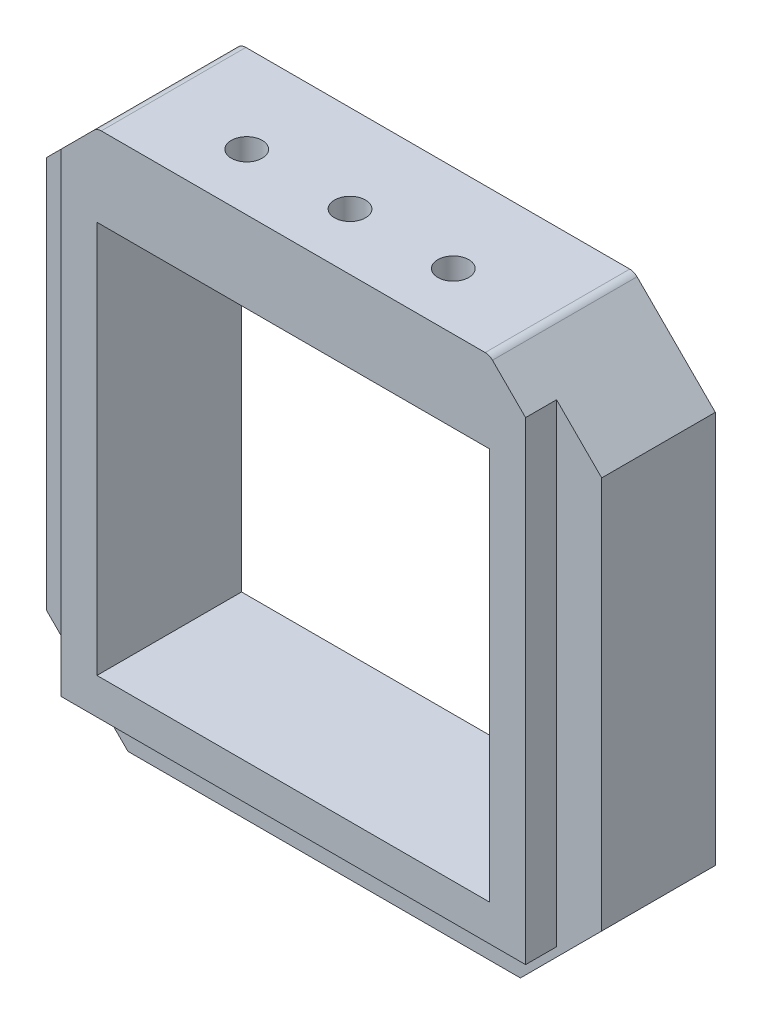
ISO-10303-21;
HEADER;
FILE_DESCRIPTION(('STEP AP214'),'2;1');
FILE_NAME('part.step','',(''),(''),'','','');
FILE_SCHEMA(('AUTOMOTIVE_DESIGN { 1 0 10303 214 1 1 1 1 }'));
ENDSEC;
DATA;
#1=APPLICATION_CONTEXT('core data for automotive mechanical design processes');
#2=APPLICATION_PROTOCOL_DEFINITION('international standard','automotive_design',2000,#1);
#3=PRODUCT_CONTEXT('',#1,'mechanical');
#4=PRODUCT('Part','Part','',(#3));
#5=PRODUCT_RELATED_PRODUCT_CATEGORY('part','',(#4));
#6=PRODUCT_DEFINITION_FORMATION('','',#4);
#7=PRODUCT_DEFINITION_CONTEXT('part definition',#1,'design');
#8=PRODUCT_DEFINITION('design','',#6,#7);
#9=PRODUCT_DEFINITION_SHAPE('','',#8);
#10=(LENGTH_UNIT() NAMED_UNIT(*) SI_UNIT(.MILLI.,.METRE.));
#11=(NAMED_UNIT(*) PLANE_ANGLE_UNIT() SI_UNIT($,.RADIAN.));
#12=(NAMED_UNIT(*) SI_UNIT($,.STERADIAN.) SOLID_ANGLE_UNIT());
#13=UNCERTAINTY_MEASURE_WITH_UNIT(LENGTH_MEASURE(1.E-05),#10,'distance_accuracy_value','');
#14=(GEOMETRIC_REPRESENTATION_CONTEXT(3) GLOBAL_UNCERTAINTY_ASSIGNED_CONTEXT((#13)) GLOBAL_UNIT_ASSIGNED_CONTEXT((#10,
#11,#12)) REPRESENTATION_CONTEXT('',''));
#15=CARTESIAN_POINT('',(0.,0.,0.));
#16=DIRECTION('',(0.,0.,1.));
#17=DIRECTION('',(1.,0.,0.));
#18=AXIS2_PLACEMENT_3D('',#15,#16,#17);
#19=CARTESIAN_POINT('',(0.,0.,15.));
#20=DIRECTION('',(0.,0.,-1.));
#21=DIRECTION('',(-1.,0.,0.));
#22=AXIS2_PLACEMENT_3D('',#19,#20,#21);
#23=PLANE('',#22);
#24=DIRECTION('',(0.,1.,0.));
#25=VECTOR('',#24,1.);
#26=CARTESIAN_POINT('',(22.4999999999998,0.,15.));
#27=LINE('',#26,#25);
#28=CARTESIAN_POINT('',(22.4999999999998,-0.999999999999926,15.));
#29=VERTEX_POINT('',#28);
#30=CARTESIAN_POINT('',(22.4999999999998,44.8700576850889,15.));
#31=VERTEX_POINT('',#30);
#32=EDGE_CURVE('E52',#29,#31,#27,.T.);
#33=ORIENTED_EDGE('',*,*,#32,.F.);
#34=DIRECTION('',(-1.,0.,0.));
#35=VECTOR('',#34,1.);
#36=CARTESIAN_POINT('',(0.,-0.999999999999933,15.));
#37=LINE('',#36,#35);
#38=CARTESIAN_POINT('',(-22.4999999999999,-0.999999999999926,15.));
#39=VERTEX_POINT('',#38);
#40=EDGE_CURVE('E200',#29,#39,#37,.T.);
#41=ORIENTED_EDGE('',*,*,#40,.T.);
#42=DIRECTION('',(0.,-1.,0.));
#43=VECTOR('',#42,1.);
#44=CARTESIAN_POINT('',(-22.4999999999999,0.,15.));
#45=LINE('',#44,#43);
#46=CARTESIAN_POINT('',(-22.5,44.8700576850888,15.));
#47=VERTEX_POINT('',#46);
#48=EDGE_CURVE('E223',#47,#39,#45,.T.);
#49=ORIENTED_EDGE('',*,*,#48,.F.);
#50=DIRECTION('',(0.707106781186546,0.707106781186549,0.));
#51=VECTOR('',#50,1.);
#52=CARTESIAN_POINT('',(-33.6850288425445,33.6850288425443,15.));
#53=LINE('',#52,#51);
#54=CARTESIAN_POINT('',(-26.8700576850888,40.5,15.));
#55=VERTEX_POINT('',#54);
#56=EDGE_CURVE('E185',#55,#47,#53,.T.);
#57=ORIENTED_EDGE('',*,*,#56,.F.);
#58=DIRECTION('',(0.,1.,0.));
#59=VECTOR('',#58,1.);
#60=CARTESIAN_POINT('',(-26.8700576850888,0.,15.));
#61=LINE('',#60,#59);
#62=CARTESIAN_POINT('',(-26.8700576850888,2.50000000000002,15.));
#63=VERTEX_POINT('',#62);
#64=EDGE_CURVE('E212',#63,#55,#61,.T.);
#65=ORIENTED_EDGE('',*,*,#64,.F.);
#66=DIRECTION('',(-0.707106781186549,0.707106781186546,0.));
#67=VECTOR('',#66,1.);
#68=CARTESIAN_POINT('',(-12.1850288425443,-12.1850288425444,15.));
#69=LINE('',#68,#67);
#70=CARTESIAN_POINT('',(-19.,-5.37005768508871,15.));
#71=VERTEX_POINT('',#70);
#72=EDGE_CURVE('E209',#71,#63,#69,.T.);
#73=ORIENTED_EDGE('',*,*,#72,.F.);
#74=DIRECTION('',(-1.,0.,0.));
#75=VECTOR('',#74,1.);
#76=CARTESIAN_POINT('',(0.,-5.37005768508872,15.));
#77=LINE('',#76,#75);
#78=CARTESIAN_POINT('',(18.9999999999998,-5.37005768508872,15.));
#79=VERTEX_POINT('',#78);
#80=EDGE_CURVE('E189',#79,#71,#77,.T.);
#81=ORIENTED_EDGE('',*,*,#80,.F.);
#82=DIRECTION('',(-0.707106781186546,-0.707106781186549,0.));
#83=VECTOR('',#82,1.);
#84=CARTESIAN_POINT('',(12.1850288425443,-12.1850288425443,15.));
#85=LINE('',#84,#83);
#86=CARTESIAN_POINT('',(26.8700576850886,2.50000000000007,15.));
#87=VERTEX_POINT('',#86);
#88=EDGE_CURVE('E186',#87,#79,#85,.T.);
#89=ORIENTED_EDGE('',*,*,#88,.F.);
#90=DIRECTION('',(0.,-1.,0.));
#91=VECTOR('',#90,1.);
#92=CARTESIAN_POINT('',(26.8700576850886,0.,15.));
#93=LINE('',#92,#91);
#94=CARTESIAN_POINT('',(26.8700576850886,40.5000000000001,15.));
#95=VERTEX_POINT('',#94);
#96=EDGE_CURVE('E222',#95,#87,#93,.T.);
#97=ORIENTED_EDGE('',*,*,#96,.F.);
#98=DIRECTION('',(0.707106781186549,-0.707106781186546,0.));
#99=VECTOR('',#98,1.);
#100=CARTESIAN_POINT('',(33.6850288425443,33.6850288425444,15.));
#101=LINE('',#100,#99);
#102=EDGE_CURVE('E57',#31,#95,#101,.T.);
#103=ORIENTED_EDGE('',*,*,#102,.F.);
#104=EDGE_LOOP('',(#33,#41,#49,#57,#65,#73,#81,#89,#97,#103));
#105=FACE_BOUND('',#104,.T.);
#106=ADVANCED_FACE('F35',(#105),#23,.F.);
#107=CARTESIAN_POINT('',(-19.,-5.37005768508871,4.));
#108=DIRECTION('',(0.,-1.,0.));
#109=DIRECTION('',(1.,0.,0.));
#110=AXIS2_PLACEMENT_3D('',#107,#108,#109);
#111=PLANE('',#110);
#112=DIRECTION('',(0.,0.,1.));
#113=VECTOR('',#112,1.);
#114=CARTESIAN_POINT('',(18.9999999999998,-5.37005768508872,4.));
#115=LINE('',#114,#113);
#116=CARTESIAN_POINT('',(18.9999999999998,-5.37005768508872,4.));
#117=VERTEX_POINT('',#116);
#118=EDGE_CURVE('E298',#117,#79,#115,.T.);
#119=ORIENTED_EDGE('',*,*,#118,.T.);
#120=ORIENTED_EDGE('',*,*,#80,.T.);
#121=DIRECTION('',(0.,0.,1.));
#122=VECTOR('',#121,1.);
#123=CARTESIAN_POINT('',(-19.,-5.37005768508871,4.));
#124=LINE('',#123,#122);
#125=CARTESIAN_POINT('',(-19.,-5.37005768508871,4.));
#126=VERTEX_POINT('',#125);
#127=EDGE_CURVE('E287',#126,#71,#124,.T.);
#128=ORIENTED_EDGE('',*,*,#127,.F.);
#129=DIRECTION('',(1.,0.,0.));
#130=VECTOR('',#129,1.);
#131=CARTESIAN_POINT('',(-19.,-5.37005768508871,4.));
#132=LINE('',#131,#130);
#133=EDGE_CURVE('E331',#126,#117,#132,.T.);
#134=ORIENTED_EDGE('',*,*,#133,.T.);
#135=EDGE_LOOP('',(#119,#120,#128,#134));
#136=FACE_BOUND('',#135,.T.);
#137=ADVANCED_FACE('F359',(#136),#111,.T.);
#138=CARTESIAN_POINT('',(-26.8700576850888,2.50000000000002,4.));
#139=DIRECTION('',(-0.707106781186546,-0.707106781186549,0.));
#140=DIRECTION('',(0.707106781186549,-0.707106781186546,0.));
#141=AXIS2_PLACEMENT_3D('',#138,#139,#140);
#142=PLANE('',#141);
#143=ORIENTED_EDGE('',*,*,#127,.T.);
#144=ORIENTED_EDGE('',*,*,#72,.T.);
#145=DIRECTION('',(0.,0.,1.));
#146=VECTOR('',#145,1.);
#147=CARTESIAN_POINT('',(-26.8700576850888,2.50000000000002,4.));
#148=LINE('',#147,#146);
#149=CARTESIAN_POINT('',(-26.8700576850888,2.50000000000002,4.));
#150=VERTEX_POINT('',#149);
#151=EDGE_CURVE('E282',#150,#63,#148,.T.);
#152=ORIENTED_EDGE('',*,*,#151,.F.);
#153=DIRECTION('',(0.707106781186549,-0.707106781186546,0.));
#154=VECTOR('',#153,1.);
#155=CARTESIAN_POINT('',(-26.8700576850888,2.50000000000002,4.));
#156=LINE('',#155,#154);
#157=EDGE_CURVE('E300',#150,#126,#156,.T.);
#158=ORIENTED_EDGE('',*,*,#157,.T.);
#159=EDGE_LOOP('',(#143,#144,#152,#158));
#160=FACE_BOUND('',#159,.T.);
#161=ADVANCED_FACE('F327',(#160),#142,.T.);
#162=CARTESIAN_POINT('',(-26.8700576850888,40.5,4.));
#163=DIRECTION('',(-1.,0.,0.));
#164=DIRECTION('',(0.,-1.,0.));
#165=AXIS2_PLACEMENT_3D('',#162,#163,#164);
#166=PLANE('',#165);
#167=ORIENTED_EDGE('',*,*,#151,.T.);
#168=ORIENTED_EDGE('',*,*,#64,.T.);
#169=DIRECTION('',(0.,0.,1.));
#170=VECTOR('',#169,1.);
#171=CARTESIAN_POINT('',(-26.8700576850888,40.5,4.));
#172=LINE('',#171,#170);
#173=CARTESIAN_POINT('',(-26.8700576850888,40.5,4.));
#174=VERTEX_POINT('',#173);
#175=EDGE_CURVE('E280',#174,#55,#172,.T.);
#176=ORIENTED_EDGE('',*,*,#175,.F.);
#177=DIRECTION('',(0.,-1.,0.));
#178=VECTOR('',#177,1.);
#179=CARTESIAN_POINT('',(-26.8700576850888,40.5,4.));
#180=LINE('',#179,#178);
#181=EDGE_CURVE('E283',#174,#150,#180,.T.);
#182=ORIENTED_EDGE('',*,*,#181,.T.);
#183=EDGE_LOOP('',(#167,#168,#176,#182));
#184=FACE_BOUND('',#183,.T.);
#185=ADVANCED_FACE('F278',(#184),#166,.T.);
#186=CARTESIAN_POINT('',(-19.,48.3700576850888,4.));
#187=DIRECTION('',(-0.707106781186549,0.707106781186546,0.));
#188=DIRECTION('',(-0.707106781186546,-0.707106781186549,0.));
#189=AXIS2_PLACEMENT_3D('',#186,#187,#188);
#190=PLANE('',#189);
#191=ORIENTED_EDGE('',*,*,#56,.T.);
#192=DIRECTION('',(0.,0.,-1.));
#193=VECTOR('',#192,1.);
#194=CARTESIAN_POINT('',(-22.5,44.8700576850888,18.));
#195=LINE('',#194,#193);
#196=CARTESIAN_POINT('',(-22.5,44.8700576850888,18.));
#197=VERTEX_POINT('',#196);
#198=EDGE_CURVE('E164',#197,#47,#195,.T.);
#199=ORIENTED_EDGE('',*,*,#198,.F.);
#200=DIRECTION('',(-0.707106781186546,-0.707106781186549,0.));
#201=VECTOR('',#200,1.);
#202=CARTESIAN_POINT('',(-33.6850288425445,33.6850288425443,18.));
#203=LINE('',#202,#201);
#204=CARTESIAN_POINT('',(-19.2928932188135,48.0771644662754,18.));
#205=VERTEX_POINT('',#204);
#206=EDGE_CURVE('E171',#205,#197,#203,.T.);
#207=ORIENTED_EDGE('',*,*,#206,.F.);
#208=DIRECTION('',(0.,0.,1.));
#209=VECTOR('',#208,1.);
#210=CARTESIAN_POINT('',(-19.2928932188135,48.0771644662754,4.));
#211=LINE('',#210,#209);
#212=CARTESIAN_POINT('',(-19.2928932188135,48.0771644662754,4.));
#213=VERTEX_POINT('',#212);
#214=EDGE_CURVE('E304',#205,#213,#211,.F.);
#215=ORIENTED_EDGE('',*,*,#214,.T.);
#216=DIRECTION('',(-0.707106781186546,-0.707106781186549,0.));
#217=VECTOR('',#216,1.);
#218=CARTESIAN_POINT('',(-19.,48.3700576850888,4.));
#219=LINE('',#218,#217);
#220=EDGE_CURVE('E315',#213,#174,#219,.T.);
#221=ORIENTED_EDGE('',*,*,#220,.T.);
#222=ORIENTED_EDGE('',*,*,#175,.T.);
#223=EDGE_LOOP('',(#191,#199,#207,#215,#221,#222));
#224=FACE_BOUND('',#223,.T.);
#225=ADVANCED_FACE('F183',(#224),#190,.T.);
#226=CARTESIAN_POINT('',(18.9999999999998,48.3700576850888,4.));
#227=DIRECTION('',(0.,1.,0.));
#228=DIRECTION('',(0.,0.,1.));
#229=AXIS2_PLACEMENT_3D('',#226,#227,#228);
#230=PLANE('',#229);
#231=CARTESIAN_POINT('',(10.,48.3700576850888,12.5));
#232=DIRECTION('',(0.,1.,0.));
#233=DIRECTION('',(0.,0.,-1.));
#234=AXIS2_PLACEMENT_3D('',#231,#232,#233);
#235=CIRCLE('',#234,1.49999999999998);
#236=CARTESIAN_POINT('',(10.,48.3700576850888,11.));
#237=VERTEX_POINT('',#236);
#238=EDGE_CURVE('E524',#237,#237,#235,.T.);
#239=ORIENTED_EDGE('',*,*,#238,.F.);
#240=EDGE_LOOP('',(#239));
#241=FACE_BOUND('',#240,.T.);
#242=CARTESIAN_POINT('',(-10.,48.3700576850888,12.5));
#243=DIRECTION('',(0.,1.,0.));
#244=DIRECTION('',(0.,0.,1.));
#245=AXIS2_PLACEMENT_3D('',#242,#243,#244);
#246=CIRCLE('',#245,1.5);
#247=CARTESIAN_POINT('',(-10.,48.3700576850888,14.));
#248=VERTEX_POINT('',#247);
#249=EDGE_CURVE('E234',#248,#248,#246,.T.);
#250=ORIENTED_EDGE('',*,*,#249,.F.);
#251=EDGE_LOOP('',(#250));
#252=FACE_BOUND('',#251,.T.);
#253=CARTESIAN_POINT('',(0.,48.3700576850888,12.5));
#254=DIRECTION('',(0.,1.,0.));
#255=DIRECTION('',(0.,0.,1.));
#256=AXIS2_PLACEMENT_3D('',#253,#254,#255);
#257=CIRCLE('',#256,1.5);
#258=CARTESIAN_POINT('',(0.,48.3700576850888,14.));
#259=VERTEX_POINT('',#258);
#260=EDGE_CURVE('E226',#259,#259,#257,.T.);
#261=ORIENTED_EDGE('',*,*,#260,.F.);
#262=EDGE_LOOP('',(#261));
#263=FACE_BOUND('',#262,.T.);
#264=DIRECTION('',(-1.,0.,0.));
#265=VECTOR('',#264,1.);
#266=CARTESIAN_POINT('',(18.9999999999998,48.3700576850888,4.));
#267=LINE('',#266,#265);
#268=CARTESIAN_POINT('',(18.5857864376267,48.3700576850888,4.));
#269=VERTEX_POINT('',#268);
#270=CARTESIAN_POINT('',(-18.5857864376269,48.3700576850888,4.));
#271=VERTEX_POINT('',#270);
#272=EDGE_CURVE('E313',#269,#271,#267,.T.);
#273=ORIENTED_EDGE('',*,*,#272,.T.);
#274=DIRECTION('',(0.,0.,1.));
#275=VECTOR('',#274,1.);
#276=CARTESIAN_POINT('',(-18.5857864376269,48.3700576850888,4.));
#277=LINE('',#276,#275);
#278=CARTESIAN_POINT('',(-18.5857864376269,48.3700576850888,18.));
#279=VERTEX_POINT('',#278);
#280=EDGE_CURVE('E302',#271,#279,#277,.T.);
#281=ORIENTED_EDGE('',*,*,#280,.T.);
#282=DIRECTION('',(-1.,0.,0.));
#283=VECTOR('',#282,1.);
#284=CARTESIAN_POINT('',(0.,48.3700576850888,18.));
#285=LINE('',#284,#283);
#286=CARTESIAN_POINT('',(18.5857864376267,48.3700576850888,18.));
#287=VERTEX_POINT('',#286);
#288=EDGE_CURVE('E246',#287,#279,#285,.T.);
#289=ORIENTED_EDGE('',*,*,#288,.F.);
#290=DIRECTION('',(0.,0.,1.));
#291=VECTOR('',#290,1.);
#292=CARTESIAN_POINT('',(18.5857864376267,48.3700576850888,4.));
#293=LINE('',#292,#291);
#294=EDGE_CURVE('E289',#287,#269,#293,.F.);
#295=ORIENTED_EDGE('',*,*,#294,.T.);
#296=EDGE_LOOP('',(#273,#281,#289,#295));
#297=FACE_BOUND('',#296,.T.);
#298=ADVANCED_FACE('F319',(#241,#252,#263,#297),#230,.T.);
#299=CARTESIAN_POINT('',(26.8700576850886,40.5000000000001,4.));
#300=DIRECTION('',(0.707106781186546,0.707106781186549,0.));
#301=DIRECTION('',(-0.707106781186549,0.707106781186546,0.));
#302=AXIS2_PLACEMENT_3D('',#299,#300,#301);
#303=PLANE('',#302);
#304=DIRECTION('',(-0.707106781186549,0.707106781186546,0.));
#305=VECTOR('',#304,1.);
#306=CARTESIAN_POINT('',(26.8700576850886,40.5000000000001,4.));
#307=LINE('',#306,#305);
#308=CARTESIAN_POINT('',(26.8700576850886,40.5000000000001,4.));
#309=VERTEX_POINT('',#308);
#310=CARTESIAN_POINT('',(19.2928932188133,48.0771644662754,4.));
#311=VERTEX_POINT('',#310);
#312=EDGE_CURVE('E321',#309,#311,#307,.T.);
#313=ORIENTED_EDGE('',*,*,#312,.T.);
#314=DIRECTION('',(0.,0.,1.));
#315=VECTOR('',#314,1.);
#316=CARTESIAN_POINT('',(19.2928932188133,48.0771644662754,4.));
#317=LINE('',#316,#315);
#318=CARTESIAN_POINT('',(19.2928932188133,48.0771644662754,18.));
#319=VERTEX_POINT('',#318);
#320=EDGE_CURVE('E11',#311,#319,#317,.T.);
#321=ORIENTED_EDGE('',*,*,#320,.T.);
#322=DIRECTION('',(-0.707106781186549,0.707106781186546,0.));
#323=VECTOR('',#322,1.);
#324=CARTESIAN_POINT('',(33.6850288425443,33.6850288425444,18.));
#325=LINE('',#324,#323);
#326=CARTESIAN_POINT('',(22.4999999999998,44.8700576850889,18.));
#327=VERTEX_POINT('',#326);
#328=EDGE_CURVE('E240',#327,#319,#325,.T.);
#329=ORIENTED_EDGE('',*,*,#328,.F.);
#330=DIRECTION('',(0.,0.,-1.));
#331=VECTOR('',#330,1.);
#332=CARTESIAN_POINT('',(22.4999999999998,44.8700576850889,18.));
#333=LINE('',#332,#331);
#334=EDGE_CURVE('E201',#327,#31,#333,.T.);
#335=ORIENTED_EDGE('',*,*,#334,.T.);
#336=ORIENTED_EDGE('',*,*,#102,.T.);
#337=DIRECTION('',(0.,0.,1.));
#338=VECTOR('',#337,1.);
#339=CARTESIAN_POINT('',(26.8700576850886,40.5000000000001,4.));
#340=LINE('',#339,#338);
#341=EDGE_CURVE('E291',#309,#95,#340,.T.);
#342=ORIENTED_EDGE('',*,*,#341,.F.);
#343=EDGE_LOOP('',(#313,#321,#329,#335,#336,#342));
#344=FACE_BOUND('',#343,.T.);
#345=ADVANCED_FACE('F266',(#344),#303,.T.);
#346=CARTESIAN_POINT('',(26.8700576850886,2.50000000000007,4.));
#347=DIRECTION('',(1.,0.,0.));
#348=DIRECTION('',(0.,0.,-1.));
#349=AXIS2_PLACEMENT_3D('',#346,#347,#348);
#350=PLANE('',#349);
#351=ORIENTED_EDGE('',*,*,#341,.T.);
#352=ORIENTED_EDGE('',*,*,#96,.T.);
#353=DIRECTION('',(0.,0.,1.));
#354=VECTOR('',#353,1.);
#355=CARTESIAN_POINT('',(26.8700576850886,2.50000000000007,4.));
#356=LINE('',#355,#354);
#357=CARTESIAN_POINT('',(26.8700576850886,2.50000000000007,4.));
#358=VERTEX_POINT('',#357);
#359=EDGE_CURVE('E296',#358,#87,#356,.T.);
#360=ORIENTED_EDGE('',*,*,#359,.F.);
#361=DIRECTION('',(0.,1.,0.));
#362=VECTOR('',#361,1.);
#363=CARTESIAN_POINT('',(26.8700576850886,2.50000000000007,4.));
#364=LINE('',#363,#362);
#365=EDGE_CURVE('E338',#358,#309,#364,.T.);
#366=ORIENTED_EDGE('',*,*,#365,.T.);
#367=EDGE_LOOP('',(#351,#352,#360,#366));
#368=FACE_BOUND('',#367,.T.);
#369=ADVANCED_FACE('F397',(#368),#350,.T.);
#370=CARTESIAN_POINT('',(18.9999999999998,-5.37005768508872,4.));
#371=DIRECTION('',(0.707106781186549,-0.707106781186546,0.));
#372=DIRECTION('',(0.707106781186546,0.707106781186549,0.));
#373=AXIS2_PLACEMENT_3D('',#370,#371,#372);
#374=PLANE('',#373);
#375=ORIENTED_EDGE('',*,*,#359,.T.);
#376=ORIENTED_EDGE('',*,*,#88,.T.);
#377=ORIENTED_EDGE('',*,*,#118,.F.);
#378=DIRECTION('',(0.707106781186546,0.707106781186549,0.));
#379=VECTOR('',#378,1.);
#380=CARTESIAN_POINT('',(18.9999999999998,-5.37005768508872,4.));
#381=LINE('',#380,#379);
#382=EDGE_CURVE('E334',#117,#358,#381,.T.);
#383=ORIENTED_EDGE('',*,*,#382,.T.);
#384=EDGE_LOOP('',(#375,#376,#377,#383));
#385=FACE_BOUND('',#384,.T.);
#386=ADVANCED_FACE('F384',(#385),#374,.T.);
#387=CARTESIAN_POINT('',(0.,0.,4.));
#388=DIRECTION('',(0.,0.,1.));
#389=DIRECTION('',(1.,0.,0.));
#390=AXIS2_PLACEMENT_3D('',#387,#388,#389);
#391=PLANE('',#390);
#392=DIRECTION('',(1.,0.,0.));
#393=VECTOR('',#392,1.);
#394=CARTESIAN_POINT('',(-19.,2.50000000000002,4.));
#395=LINE('',#394,#393);
#396=CARTESIAN_POINT('',(-19.,2.50000000000002,4.));
#397=VERTEX_POINT('',#396);
#398=CARTESIAN_POINT('',(18.9999999999998,2.50000000000007,4.));
#399=VERTEX_POINT('',#398);
#400=EDGE_CURVE('E418',#397,#399,#395,.T.);
#401=ORIENTED_EDGE('',*,*,#400,.T.);
#402=DIRECTION('',(0.,1.,0.));
#403=VECTOR('',#402,1.);
#404=CARTESIAN_POINT('',(18.9999999999998,2.50000000000007,4.));
#405=LINE('',#404,#403);
#406=CARTESIAN_POINT('',(18.9999999999998,40.5000000000001,4.));
#407=VERTEX_POINT('',#406);
#408=EDGE_CURVE('E408',#399,#407,#405,.T.);
#409=ORIENTED_EDGE('',*,*,#408,.T.);
#410=DIRECTION('',(-1.,0.,0.));
#411=VECTOR('',#410,1.);
#412=CARTESIAN_POINT('',(18.9999999999998,40.5000000000001,4.));
#413=LINE('',#412,#411);
#414=CARTESIAN_POINT('',(-19.,40.5,4.));
#415=VERTEX_POINT('',#414);
#416=EDGE_CURVE('E410',#407,#415,#413,.T.);
#417=ORIENTED_EDGE('',*,*,#416,.T.);
#418=DIRECTION('',(0.,-1.,0.));
#419=VECTOR('',#418,1.);
#420=CARTESIAN_POINT('',(-19.,40.5,4.));
#421=LINE('',#420,#419);
#422=EDGE_CURVE('E415',#415,#397,#421,.T.);
#423=ORIENTED_EDGE('',*,*,#422,.T.);
#424=EDGE_LOOP('',(#401,#409,#417,#423));
#425=FACE_BOUND('',#424,.T.);
#426=ORIENTED_EDGE('',*,*,#220,.F.);
#427=CARTESIAN_POINT('',(-18.5857864376269,47.3700576850888,4.));
#428=DIRECTION('',(0.,0.,1.));
#429=DIRECTION('',(1.,0.,0.));
#430=AXIS2_PLACEMENT_3D('',#427,#428,#429);
#431=CIRCLE('',#430,1.);
#432=EDGE_CURVE('E44',#213,#271,#431,.F.);
#433=ORIENTED_EDGE('',*,*,#432,.T.);
#434=ORIENTED_EDGE('',*,*,#272,.F.);
#435=CARTESIAN_POINT('',(18.5857864376267,47.3700576850888,4.));
#436=DIRECTION('',(0.,0.,1.));
#437=DIRECTION('',(1.,0.,0.));
#438=AXIS2_PLACEMENT_3D('',#435,#436,#437);
#439=CIRCLE('',#438,1.);
#440=EDGE_CURVE('E306',#269,#311,#439,.F.);
#441=ORIENTED_EDGE('',*,*,#440,.T.);
#442=ORIENTED_EDGE('',*,*,#312,.F.);
#443=ORIENTED_EDGE('',*,*,#365,.F.);
#444=ORIENTED_EDGE('',*,*,#382,.F.);
#445=ORIENTED_EDGE('',*,*,#133,.F.);
#446=ORIENTED_EDGE('',*,*,#157,.F.);
#447=ORIENTED_EDGE('',*,*,#181,.F.);
#448=EDGE_LOOP('',(#426,#433,#434,#441,#442,#443,#444,#445,#446,#447));
#449=FACE_BOUND('',#448,.T.);
#450=ADVANCED_FACE('F312',(#425,#449),#391,.F.);
#451=CARTESIAN_POINT('',(18.9999999999998,2.50000000000007,4.));
#452=DIRECTION('',(1.,0.,0.));
#453=DIRECTION('',(0.,1.,0.));
#454=AXIS2_PLACEMENT_3D('',#451,#452,#453);
#455=PLANE('',#454);
#456=DIRECTION('',(0.,0.,1.));
#457=VECTOR('',#456,1.);
#458=CARTESIAN_POINT('',(18.9999999999998,2.50000000000007,4.));
#459=LINE('',#458,#457);
#460=CARTESIAN_POINT('',(18.9999999999998,2.50000000000007,18.));
#461=VERTEX_POINT('',#460);
#462=EDGE_CURVE('E336',#399,#461,#459,.T.);
#463=ORIENTED_EDGE('',*,*,#462,.T.);
#464=DIRECTION('',(0.,-1.,0.));
#465=VECTOR('',#464,1.);
#466=CARTESIAN_POINT('',(18.9999999999998,0.,18.));
#467=LINE('',#466,#465);
#468=CARTESIAN_POINT('',(18.9999999999998,40.5000000000001,18.));
#469=VERTEX_POINT('',#468);
#470=EDGE_CURVE('E255',#469,#461,#467,.T.);
#471=ORIENTED_EDGE('',*,*,#470,.F.);
#472=DIRECTION('',(0.,0.,1.));
#473=VECTOR('',#472,1.);
#474=CARTESIAN_POINT('',(18.9999999999998,40.5000000000001,4.));
#475=LINE('',#474,#473);
#476=EDGE_CURVE('E343',#407,#469,#475,.T.);
#477=ORIENTED_EDGE('',*,*,#476,.F.);
#478=ORIENTED_EDGE('',*,*,#408,.F.);
#479=EDGE_LOOP('',(#463,#471,#477,#478));
#480=FACE_BOUND('',#479,.T.);
#481=ADVANCED_FACE('F371',(#480),#455,.F.);
#482=CARTESIAN_POINT('',(-19.,2.50000000000002,4.));
#483=DIRECTION('',(0.,-1.,0.));
#484=DIRECTION('',(1.,0.,0.));
#485=AXIS2_PLACEMENT_3D('',#482,#483,#484);
#486=PLANE('',#485);
#487=DIRECTION('',(0.,0.,1.));
#488=VECTOR('',#487,1.);
#489=CARTESIAN_POINT('',(-19.,2.50000000000002,4.));
#490=LINE('',#489,#488);
#491=CARTESIAN_POINT('',(-19.,2.50000000000002,18.));
#492=VERTEX_POINT('',#491);
#493=EDGE_CURVE('E340',#397,#492,#490,.T.);
#494=ORIENTED_EDGE('',*,*,#493,.T.);
#495=DIRECTION('',(-1.,0.,0.));
#496=VECTOR('',#495,1.);
#497=CARTESIAN_POINT('',(0.,2.50000000000005,18.));
#498=LINE('',#497,#496);
#499=EDGE_CURVE('E257',#461,#492,#498,.T.);
#500=ORIENTED_EDGE('',*,*,#499,.F.);
#501=ORIENTED_EDGE('',*,*,#462,.F.);
#502=ORIENTED_EDGE('',*,*,#400,.F.);
#503=EDGE_LOOP('',(#494,#500,#501,#502));
#504=FACE_BOUND('',#503,.T.);
#505=ADVANCED_FACE('F367',(#504),#486,.F.);
#506=CARTESIAN_POINT('',(-19.,40.5,4.));
#507=DIRECTION('',(-1.,0.,0.));
#508=DIRECTION('',(0.,-1.,0.));
#509=AXIS2_PLACEMENT_3D('',#506,#507,#508);
#510=PLANE('',#509);
#511=DIRECTION('',(0.,0.,1.));
#512=VECTOR('',#511,1.);
#513=CARTESIAN_POINT('',(-19.,40.5,4.));
#514=LINE('',#513,#512);
#515=CARTESIAN_POINT('',(-19.,40.5,18.));
#516=VERTEX_POINT('',#515);
#517=EDGE_CURVE('E421',#415,#516,#514,.T.);
#518=ORIENTED_EDGE('',*,*,#517,.T.);
#519=DIRECTION('',(0.,1.,0.));
#520=VECTOR('',#519,1.);
#521=CARTESIAN_POINT('',(-19.,0.,18.));
#522=LINE('',#521,#520);
#523=EDGE_CURVE('E249',#492,#516,#522,.T.);
#524=ORIENTED_EDGE('',*,*,#523,.F.);
#525=ORIENTED_EDGE('',*,*,#493,.F.);
#526=ORIENTED_EDGE('',*,*,#422,.F.);
#527=EDGE_LOOP('',(#518,#524,#525,#526));
#528=FACE_BOUND('',#527,.T.);
#529=ADVANCED_FACE('F370',(#528),#510,.F.);
#530=CARTESIAN_POINT('',(18.9999999999998,40.5000000000001,4.));
#531=DIRECTION('',(0.,1.,0.));
#532=DIRECTION('',(-1.,0.,0.));
#533=AXIS2_PLACEMENT_3D('',#530,#531,#532);
#534=PLANE('',#533);
#535=ORIENTED_EDGE('',*,*,#476,.T.);
#536=DIRECTION('',(-1.,0.,0.));
#537=VECTOR('',#536,1.);
#538=CARTESIAN_POINT('',(0.,40.5,18.));
#539=LINE('',#538,#537);
#540=EDGE_CURVE('E252',#469,#516,#539,.T.);
#541=ORIENTED_EDGE('',*,*,#540,.T.);
#542=ORIENTED_EDGE('',*,*,#517,.F.);
#543=ORIENTED_EDGE('',*,*,#416,.F.);
#544=EDGE_LOOP('',(#535,#541,#542,#543));
#545=FACE_BOUND('',#544,.T.);
#546=ADVANCED_FACE('F357',(#545),#534,.F.);
#547=CARTESIAN_POINT('',(-18.5857864376269,47.3700576850888,4.));
#548=DIRECTION('',(0.,0.,1.));
#549=DIRECTION('',(1.,0.,0.));
#550=AXIS2_PLACEMENT_3D('',#547,#548,#549);
#551=CYLINDRICAL_SURFACE('',#550,1.);
#552=ORIENTED_EDGE('',*,*,#432,.F.);
#553=ORIENTED_EDGE('',*,*,#214,.F.);
#554=CARTESIAN_POINT('',(-18.5857864376269,47.3700576850888,18.));
#555=DIRECTION('',(0.,0.,1.));
#556=DIRECTION('',(1.,0.,0.));
#557=AXIS2_PLACEMENT_3D('',#554,#555,#556);
#558=CIRCLE('',#557,1.);
#559=EDGE_CURVE('E179',#279,#205,#558,.T.);
#560=ORIENTED_EDGE('',*,*,#559,.F.);
#561=ORIENTED_EDGE('',*,*,#280,.F.);
#562=EDGE_LOOP('',(#552,#553,#560,#561));
#563=FACE_BOUND('',#562,.T.);
#564=ADVANCED_FACE('F323',(#563),#551,.T.);
#565=CARTESIAN_POINT('',(18.5857864376267,47.3700576850888,4.));
#566=DIRECTION('',(0.,0.,1.));
#567=DIRECTION('',(1.,0.,0.));
#568=AXIS2_PLACEMENT_3D('',#565,#566,#567);
#569=CYLINDRICAL_SURFACE('',#568,1.);
#570=ORIENTED_EDGE('',*,*,#440,.F.);
#571=ORIENTED_EDGE('',*,*,#294,.F.);
#572=CARTESIAN_POINT('',(18.5857864376267,47.3700576850888,18.));
#573=DIRECTION('',(0.,0.,1.));
#574=DIRECTION('',(1.,0.,0.));
#575=AXIS2_PLACEMENT_3D('',#572,#573,#574);
#576=CIRCLE('',#575,1.);
#577=EDGE_CURVE('E243',#319,#287,#576,.T.);
#578=ORIENTED_EDGE('',*,*,#577,.F.);
#579=ORIENTED_EDGE('',*,*,#320,.F.);
#580=EDGE_LOOP('',(#570,#571,#578,#579));
#581=FACE_BOUND('',#580,.T.);
#582=ADVANCED_FACE('F37',(#581),#569,.T.);
#583=CARTESIAN_POINT('',(-22.4999999999999,0.,18.));
#584=DIRECTION('',(1.,0.,0.));
#585=DIRECTION('',(0.,1.,0.));
#586=AXIS2_PLACEMENT_3D('',#583,#584,#585);
#587=PLANE('',#586);
#588=ORIENTED_EDGE('',*,*,#48,.T.);
#589=DIRECTION('',(0.,0.,-1.));
#590=VECTOR('',#589,1.);
#591=CARTESIAN_POINT('',(-22.4999999999999,-0.999999999999926,18.));
#592=LINE('',#591,#590);
#593=CARTESIAN_POINT('',(-22.4999999999999,-0.999999999999926,18.));
#594=VERTEX_POINT('',#593);
#595=EDGE_CURVE('E166',#594,#39,#592,.T.);
#596=ORIENTED_EDGE('',*,*,#595,.F.);
#597=DIRECTION('',(0.,-1.,0.));
#598=VECTOR('',#597,1.);
#599=CARTESIAN_POINT('',(-22.4999999999999,0.,18.));
#600=LINE('',#599,#598);
#601=EDGE_CURVE('E159',#197,#594,#600,.T.);
#602=ORIENTED_EDGE('',*,*,#601,.F.);
#603=ORIENTED_EDGE('',*,*,#198,.T.);
#604=EDGE_LOOP('',(#588,#596,#602,#603));
#605=FACE_BOUND('',#604,.T.);
#606=ADVANCED_FACE('F162',(#605),#587,.F.);
#607=CARTESIAN_POINT('',(0.,-0.999999999999933,18.));
#608=DIRECTION('',(0.,-1.,0.));
#609=DIRECTION('',(1.,0.,0.));
#610=AXIS2_PLACEMENT_3D('',#607,#608,#609);
#611=PLANE('',#610);
#612=ORIENTED_EDGE('',*,*,#40,.F.);
#613=DIRECTION('',(0.,0.,-1.));
#614=VECTOR('',#613,1.);
#615=CARTESIAN_POINT('',(22.4999999999998,-0.999999999999926,18.));
#616=LINE('',#615,#614);
#617=CARTESIAN_POINT('',(22.4999999999998,-0.999999999999926,18.));
#618=VERTEX_POINT('',#617);
#619=EDGE_CURVE('E191',#618,#29,#616,.T.);
#620=ORIENTED_EDGE('',*,*,#619,.F.);
#621=DIRECTION('',(-1.,0.,0.));
#622=VECTOR('',#621,1.);
#623=CARTESIAN_POINT('',(0.,-0.999999999999933,18.));
#624=LINE('',#623,#622);
#625=EDGE_CURVE('E170',#618,#594,#624,.T.);
#626=ORIENTED_EDGE('',*,*,#625,.T.);
#627=ORIENTED_EDGE('',*,*,#595,.T.);
#628=EDGE_LOOP('',(#612,#620,#626,#627));
#629=FACE_BOUND('',#628,.T.);
#630=ADVANCED_FACE('F273',(#629),#611,.T.);
#631=CARTESIAN_POINT('',(22.4999999999998,0.,18.));
#632=DIRECTION('',(-1.,0.,0.));
#633=DIRECTION('',(0.,0.,1.));
#634=AXIS2_PLACEMENT_3D('',#631,#632,#633);
#635=PLANE('',#634);
#636=ORIENTED_EDGE('',*,*,#32,.T.);
#637=ORIENTED_EDGE('',*,*,#334,.F.);
#638=DIRECTION('',(0.,1.,0.));
#639=VECTOR('',#638,1.);
#640=CARTESIAN_POINT('',(22.4999999999998,0.,18.));
#641=LINE('',#640,#639);
#642=EDGE_CURVE('E238',#618,#327,#641,.T.);
#643=ORIENTED_EDGE('',*,*,#642,.F.);
#644=ORIENTED_EDGE('',*,*,#619,.T.);
#645=EDGE_LOOP('',(#636,#637,#643,#644));
#646=FACE_BOUND('',#645,.T.);
#647=ADVANCED_FACE('F270',(#646),#635,.F.);
#648=CARTESIAN_POINT('',(0.,0.,18.));
#649=DIRECTION('',(0.,0.,1.));
#650=DIRECTION('',(1.,0.,0.));
#651=AXIS2_PLACEMENT_3D('',#648,#649,#650);
#652=PLANE('',#651);
#653=ORIENTED_EDGE('',*,*,#206,.T.);
#654=ORIENTED_EDGE('',*,*,#601,.T.);
#655=ORIENTED_EDGE('',*,*,#625,.F.);
#656=ORIENTED_EDGE('',*,*,#642,.T.);
#657=ORIENTED_EDGE('',*,*,#328,.T.);
#658=ORIENTED_EDGE('',*,*,#577,.T.);
#659=ORIENTED_EDGE('',*,*,#288,.T.);
#660=ORIENTED_EDGE('',*,*,#559,.T.);
#661=EDGE_LOOP('',(#653,#654,#655,#656,#657,#658,#659,#660));
#662=FACE_BOUND('',#661,.T.);
#663=ORIENTED_EDGE('',*,*,#523,.T.);
#664=ORIENTED_EDGE('',*,*,#540,.F.);
#665=ORIENTED_EDGE('',*,*,#470,.T.);
#666=ORIENTED_EDGE('',*,*,#499,.T.);
#667=EDGE_LOOP('',(#663,#664,#665,#666));
#668=FACE_BOUND('',#667,.T.);
#669=ADVANCED_FACE('F175',(#662,#668),#652,.T.);
#670=CARTESIAN_POINT('',(0.,43.3700576850888,12.5));
#671=DIRECTION('',(0.,1.,0.));
#672=DIRECTION('',(0.,0.,1.));
#673=AXIS2_PLACEMENT_3D('',#670,#671,#672);
#674=CYLINDRICAL_SURFACE('',#673,1.5);
#675=CARTESIAN_POINT('',(0.,43.3700576850888,12.5));
#676=DIRECTION('',(0.,1.,0.));
#677=DIRECTION('',(0.,0.,1.));
#678=AXIS2_PLACEMENT_3D('',#675,#676,#677);
#679=CIRCLE('',#678,1.5);
#680=CARTESIAN_POINT('',(0.,43.3700576850888,14.));
#681=VERTEX_POINT('',#680);
#682=EDGE_CURVE('E224',#681,#681,#679,.T.);
#683=ORIENTED_EDGE('',*,*,#682,.F.);
#684=EDGE_LOOP('',(#683));
#685=FACE_BOUND('',#684,.T.);
#686=ORIENTED_EDGE('',*,*,#260,.T.);
#687=EDGE_LOOP('',(#686));
#688=FACE_BOUND('',#687,.T.);
#689=ADVANCED_FACE('F429',(#685,#688),#674,.F.);
#690=CARTESIAN_POINT('',(0.,43.3700576850888,12.5));
#691=DIRECTION('',(0.,1.,0.));
#692=DIRECTION('',(0.,0.,1.));
#693=AXIS2_PLACEMENT_3D('',#690,#691,#692);
#694=PLANE('',#693);
#695=ORIENTED_EDGE('',*,*,#682,.T.);
#696=EDGE_LOOP('',(#695));
#697=FACE_BOUND('',#696,.T.);
#698=ADVANCED_FACE('F435',(#697),#694,.T.);
#699=CARTESIAN_POINT('',(-10.,43.3700576850888,12.5));
#700=DIRECTION('',(0.,1.,0.));
#701=DIRECTION('',(0.,0.,1.));
#702=AXIS2_PLACEMENT_3D('',#699,#700,#701);
#703=CYLINDRICAL_SURFACE('',#702,1.5);
#704=CARTESIAN_POINT('',(-10.,43.3700576850888,12.5));
#705=DIRECTION('',(0.,1.,0.));
#706=DIRECTION('',(0.,0.,1.));
#707=AXIS2_PLACEMENT_3D('',#704,#705,#706);
#708=CIRCLE('',#707,1.5);
#709=CARTESIAN_POINT('',(-10.,43.3700576850888,14.));
#710=VERTEX_POINT('',#709);
#711=EDGE_CURVE('E231',#710,#710,#708,.T.);
#712=ORIENTED_EDGE('',*,*,#711,.F.);
#713=EDGE_LOOP('',(#712));
#714=FACE_BOUND('',#713,.T.);
#715=ORIENTED_EDGE('',*,*,#249,.T.);
#716=EDGE_LOOP('',(#715));
#717=FACE_BOUND('',#716,.T.);
#718=ADVANCED_FACE('F479',(#714,#717),#703,.F.);
#719=CARTESIAN_POINT('',(-10.,43.3700576850888,12.5));
#720=DIRECTION('',(0.,1.,0.));
#721=DIRECTION('',(0.,0.,1.));
#722=AXIS2_PLACEMENT_3D('',#719,#720,#721);
#723=PLANE('',#722);
#724=ORIENTED_EDGE('',*,*,#711,.T.);
#725=EDGE_LOOP('',(#724));
#726=FACE_BOUND('',#725,.T.);
#727=ADVANCED_FACE('F487',(#726),#723,.T.);
#728=CARTESIAN_POINT('',(10.,43.3700576850888,12.5));
#729=DIRECTION('',(0.,1.,0.));
#730=DIRECTION('',(0.,0.,1.));
#731=AXIS2_PLACEMENT_3D('',#728,#729,#730);
#732=CYLINDRICAL_SURFACE('',#731,1.49999999999998);
#733=CARTESIAN_POINT('',(10.,43.3700576850888,12.5));
#734=DIRECTION('',(0.,1.,0.));
#735=DIRECTION('',(0.,0.,-1.));
#736=AXIS2_PLACEMENT_3D('',#733,#734,#735);
#737=CIRCLE('',#736,1.49999999999998);
#738=CARTESIAN_POINT('',(10.,43.3700576850888,11.));
#739=VERTEX_POINT('',#738);
#740=EDGE_CURVE('E523',#739,#739,#737,.T.);
#741=ORIENTED_EDGE('',*,*,#740,.F.);
#742=EDGE_LOOP('',(#741));
#743=FACE_BOUND('',#742,.T.);
#744=ORIENTED_EDGE('',*,*,#238,.T.);
#745=EDGE_LOOP('',(#744));
#746=FACE_BOUND('',#745,.T.);
#747=ADVANCED_FACE('F497',(#743,#746),#732,.F.);
#748=CARTESIAN_POINT('',(10.,43.3700576850888,12.5));
#749=DIRECTION('',(0.,-1.,0.));
#750=DIRECTION('',(0.,0.,-1.));
#751=AXIS2_PLACEMENT_3D('',#748,#749,#750);
#752=PLANE('',#751);
#753=ORIENTED_EDGE('',*,*,#740,.T.);
#754=EDGE_LOOP('',(#753));
#755=FACE_BOUND('',#754,.T.);
#756=ADVANCED_FACE('F507',(#755),#752,.F.);
#757=CLOSED_SHELL('',(#106,#137,#161,#185,#225,#298,#345,#369,#386,#450,#481,#505,#529,#546,
#564,#582,#606,#630,#647,#669,#689,#698,#718,#727,#747,#756));
#758=MANIFOLD_SOLID_BREP('B2',#757);
#759=ADVANCED_BREP_SHAPE_REPRESENTATION('',(#18,#758),#14);
#760=SHAPE_DEFINITION_REPRESENTATION(#9,#759);
ENDSEC;
END-ISO-10303-21;
